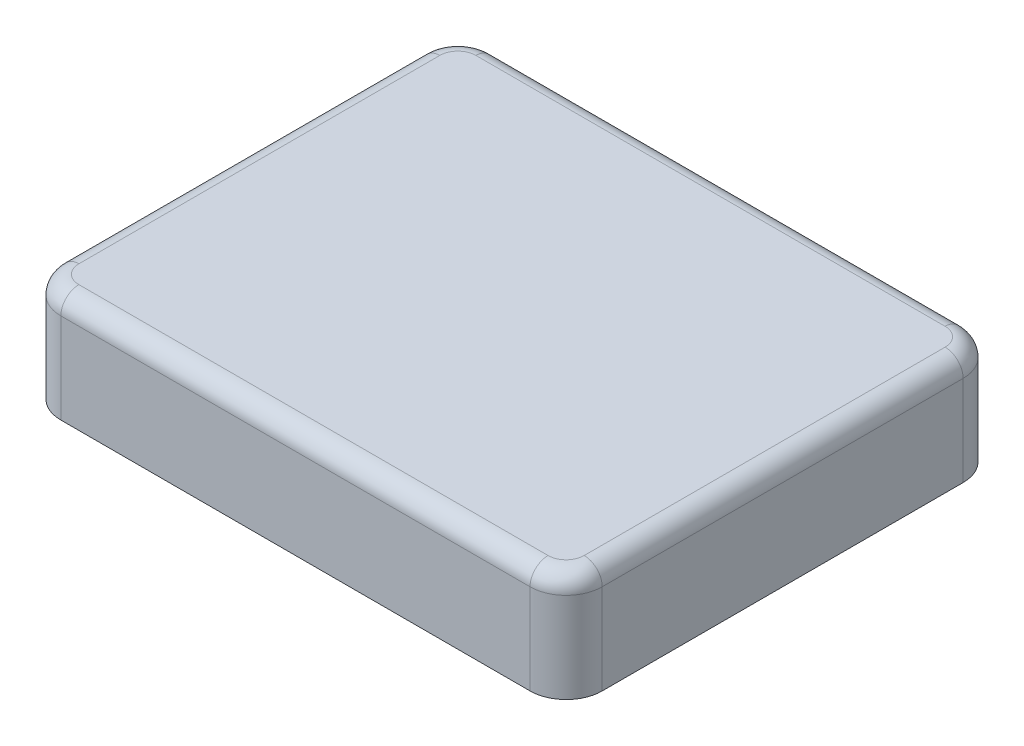
ISO-10303-21;
HEADER;
FILE_DESCRIPTION(('STEP AP214'),'2;1');
FILE_NAME('part.step','',(''),(''),'','','');
FILE_SCHEMA(('AUTOMOTIVE_DESIGN { 1 0 10303 214 1 1 1 1 }'));
ENDSEC;
DATA;
#1=APPLICATION_CONTEXT('core data for automotive mechanical design processes');
#2=APPLICATION_PROTOCOL_DEFINITION('international standard','automotive_design',2000,#1);
#3=PRODUCT_CONTEXT('',#1,'mechanical');
#4=PRODUCT('Part','Part','',(#3));
#5=PRODUCT_RELATED_PRODUCT_CATEGORY('part','',(#4));
#6=PRODUCT_DEFINITION_FORMATION('','',#4);
#7=PRODUCT_DEFINITION_CONTEXT('part definition',#1,'design');
#8=PRODUCT_DEFINITION('design','',#6,#7);
#9=PRODUCT_DEFINITION_SHAPE('','',#8);
#10=(LENGTH_UNIT() NAMED_UNIT(*) SI_UNIT(.MILLI.,.METRE.));
#11=(NAMED_UNIT(*) PLANE_ANGLE_UNIT() SI_UNIT($,.RADIAN.));
#12=(NAMED_UNIT(*) SI_UNIT($,.STERADIAN.) SOLID_ANGLE_UNIT());
#13=UNCERTAINTY_MEASURE_WITH_UNIT(LENGTH_MEASURE(1.E-05),#10,'distance_accuracy_value','');
#14=(GEOMETRIC_REPRESENTATION_CONTEXT(3) GLOBAL_UNCERTAINTY_ASSIGNED_CONTEXT((#13)) GLOBAL_UNIT_ASSIGNED_CONTEXT((#10,
#11,#12)) REPRESENTATION_CONTEXT('',''));
#15=CARTESIAN_POINT('',(0.,0.,0.));
#16=DIRECTION('',(0.,0.,1.));
#17=DIRECTION('',(1.,0.,0.));
#18=AXIS2_PLACEMENT_3D('',#15,#16,#17);
#19=CARTESIAN_POINT('',(0.,0.,0.));
#20=DIRECTION('',(0.,1.,0.));
#21=DIRECTION('',(0.,0.,1.));
#22=AXIS2_PLACEMENT_3D('',#19,#20,#21);
#23=PLANE('',#22);
#24=DIRECTION('',(0.,0.,1.));
#25=VECTOR('',#24,1.);
#26=CARTESIAN_POINT('',(-75.,0.,-60.));
#27=LINE('',#26,#25);
#28=CARTESIAN_POINT('',(-75.,0.,-50.));
#29=VERTEX_POINT('',#28);
#30=CARTESIAN_POINT('',(-75.,0.,50.));
#31=VERTEX_POINT('',#30);
#32=EDGE_CURVE('E242',#29,#31,#27,.T.);
#33=ORIENTED_EDGE('',*,*,#32,.F.);
#34=CARTESIAN_POINT('',(-65.,0.,-50.));
#35=DIRECTION('',(0.,1.,0.));
#36=DIRECTION('',(0.,0.,1.));
#37=AXIS2_PLACEMENT_3D('',#34,#35,#36);
#38=CIRCLE('',#37,10.);
#39=CARTESIAN_POINT('',(-65.,0.,-60.));
#40=VERTEX_POINT('',#39);
#41=EDGE_CURVE('E285',#29,#40,#38,.F.);
#42=ORIENTED_EDGE('',*,*,#41,.T.);
#43=DIRECTION('',(-1.,0.,0.));
#44=VECTOR('',#43,1.);
#45=CARTESIAN_POINT('',(-75.,0.,-60.));
#46=LINE('',#45,#44);
#47=CARTESIAN_POINT('',(65.,0.,-60.));
#48=VERTEX_POINT('',#47);
#49=EDGE_CURVE('E271',#48,#40,#46,.T.);
#50=ORIENTED_EDGE('',*,*,#49,.F.);
#51=CARTESIAN_POINT('',(65.,0.,-50.));
#52=DIRECTION('',(0.,1.,0.));
#53=DIRECTION('',(0.,0.,1.));
#54=AXIS2_PLACEMENT_3D('',#51,#52,#53);
#55=CIRCLE('',#54,10.);
#56=CARTESIAN_POINT('',(75.,0.,-50.));
#57=VERTEX_POINT('',#56);
#58=EDGE_CURVE('E281',#48,#57,#55,.F.);
#59=ORIENTED_EDGE('',*,*,#58,.T.);
#60=DIRECTION('',(0.,0.,-1.));
#61=VECTOR('',#60,1.);
#62=CARTESIAN_POINT('',(75.,0.,-60.));
#63=LINE('',#62,#61);
#64=CARTESIAN_POINT('',(75.,0.,50.));
#65=VERTEX_POINT('',#64);
#66=EDGE_CURVE('E268',#65,#57,#63,.T.);
#67=ORIENTED_EDGE('',*,*,#66,.F.);
#68=CARTESIAN_POINT('',(65.,0.,50.));
#69=DIRECTION('',(0.,1.,0.));
#70=DIRECTION('',(0.,0.,1.));
#71=AXIS2_PLACEMENT_3D('',#68,#69,#70);
#72=CIRCLE('',#71,10.);
#73=CARTESIAN_POINT('',(65.,0.,60.));
#74=VERTEX_POINT('',#73);
#75=EDGE_CURVE('E279',#65,#74,#72,.F.);
#76=ORIENTED_EDGE('',*,*,#75,.T.);
#77=DIRECTION('',(1.,0.,0.));
#78=VECTOR('',#77,1.);
#79=CARTESIAN_POINT('',(-75.,0.,60.));
#80=LINE('',#79,#78);
#81=CARTESIAN_POINT('',(-65.,0.,60.));
#82=VERTEX_POINT('',#81);
#83=EDGE_CURVE('E265',#82,#74,#80,.T.);
#84=ORIENTED_EDGE('',*,*,#83,.F.);
#85=CARTESIAN_POINT('',(-65.,0.,50.));
#86=DIRECTION('',(0.,1.,0.));
#87=DIRECTION('',(0.,0.,1.));
#88=AXIS2_PLACEMENT_3D('',#85,#86,#87);
#89=CIRCLE('',#88,10.);
#90=EDGE_CURVE('E283',#82,#31,#89,.F.);
#91=ORIENTED_EDGE('',*,*,#90,.T.);
#92=EDGE_LOOP('',(#33,#42,#50,#59,#67,#76,#84,#91));
#93=FACE_BOUND('',#92,.T.);
#94=CARTESIAN_POINT('',(-65.,0.,-50.));
#95=DIRECTION('',(0.,1.,0.));
#96=DIRECTION('',(0.,0.,1.));
#97=AXIS2_PLACEMENT_3D('',#94,#95,#96);
#98=CIRCLE('',#97,6.5);
#99=CARTESIAN_POINT('',(-71.5,0.,-50.));
#100=VERTEX_POINT('',#99);
#101=CARTESIAN_POINT('',(-65.,0.,-56.5));
#102=VERTEX_POINT('',#101);
#103=EDGE_CURVE('E245',#100,#102,#98,.F.);
#104=ORIENTED_EDGE('',*,*,#103,.F.);
#105=DIRECTION('',(0.,0.,1.));
#106=VECTOR('',#105,1.);
#107=CARTESIAN_POINT('',(-71.5,0.,-60.));
#108=LINE('',#107,#106);
#109=CARTESIAN_POINT('',(-71.5,0.,50.));
#110=VERTEX_POINT('',#109);
#111=EDGE_CURVE('E247',#100,#110,#108,.T.);
#112=ORIENTED_EDGE('',*,*,#111,.T.);
#113=CARTESIAN_POINT('',(-65.,0.,50.));
#114=DIRECTION('',(0.,1.,0.));
#115=DIRECTION('',(0.,0.,1.));
#116=AXIS2_PLACEMENT_3D('',#113,#114,#115);
#117=CIRCLE('',#116,6.5);
#118=CARTESIAN_POINT('',(-65.,0.,56.5));
#119=VERTEX_POINT('',#118);
#120=EDGE_CURVE('E199',#119,#110,#117,.F.);
#121=ORIENTED_EDGE('',*,*,#120,.F.);
#122=DIRECTION('',(1.,0.,0.));
#123=VECTOR('',#122,1.);
#124=CARTESIAN_POINT('',(-75.,0.,56.5));
#125=LINE('',#124,#123);
#126=CARTESIAN_POINT('',(65.,0.,56.5));
#127=VERTEX_POINT('',#126);
#128=EDGE_CURVE('E249',#119,#127,#125,.T.);
#129=ORIENTED_EDGE('',*,*,#128,.T.);
#130=CARTESIAN_POINT('',(65.,0.,50.));
#131=DIRECTION('',(0.,1.,0.));
#132=DIRECTION('',(0.,0.,1.));
#133=AXIS2_PLACEMENT_3D('',#130,#131,#132);
#134=CIRCLE('',#133,6.5);
#135=CARTESIAN_POINT('',(71.5,0.,50.));
#136=VERTEX_POINT('',#135);
#137=EDGE_CURVE('E256',#136,#127,#134,.F.);
#138=ORIENTED_EDGE('',*,*,#137,.F.);
#139=DIRECTION('',(0.,0.,-1.));
#140=VECTOR('',#139,1.);
#141=CARTESIAN_POINT('',(71.5,0.,-60.));
#142=LINE('',#141,#140);
#143=CARTESIAN_POINT('',(71.5,0.,-50.));
#144=VERTEX_POINT('',#143);
#145=EDGE_CURVE('E253',#136,#144,#142,.T.);
#146=ORIENTED_EDGE('',*,*,#145,.T.);
#147=CARTESIAN_POINT('',(65.,0.,-50.));
#148=DIRECTION('',(0.,1.,0.));
#149=DIRECTION('',(0.,0.,1.));
#150=AXIS2_PLACEMENT_3D('',#147,#148,#149);
#151=CIRCLE('',#150,6.5);
#152=CARTESIAN_POINT('',(65.,0.,-56.5));
#153=VERTEX_POINT('',#152);
#154=EDGE_CURVE('E254',#153,#144,#151,.F.);
#155=ORIENTED_EDGE('',*,*,#154,.F.);
#156=DIRECTION('',(-1.,0.,0.));
#157=VECTOR('',#156,1.);
#158=CARTESIAN_POINT('',(-75.,0.,-56.5));
#159=LINE('',#158,#157);
#160=EDGE_CURVE('E213',#153,#102,#159,.T.);
#161=ORIENTED_EDGE('',*,*,#160,.T.);
#162=EDGE_LOOP('',(#104,#112,#121,#129,#138,#146,#155,#161));
#163=FACE_BOUND('',#162,.T.);
#164=ADVANCED_FACE('F53',(#93,#163),#23,.F.);
#165=CARTESIAN_POINT('',(-75.,30.,-60.));
#166=DIRECTION('',(1.,0.,0.));
#167=DIRECTION('',(0.,0.,-1.));
#168=AXIS2_PLACEMENT_3D('',#165,#166,#167);
#169=PLANE('',#168);
#170=DIRECTION('',(0.,-1.,0.));
#171=VECTOR('',#170,1.);
#172=CARTESIAN_POINT('',(-75.,30.,50.));
#173=LINE('',#172,#171);
#174=CARTESIAN_POINT('',(-75.,25.,50.));
#175=VERTEX_POINT('',#174);
#176=EDGE_CURVE('E274',#31,#175,#173,.F.);
#177=ORIENTED_EDGE('',*,*,#176,.T.);
#178=DIRECTION('',(0.,0.,1.));
#179=VECTOR('',#178,1.);
#180=CARTESIAN_POINT('',(-75.,25.,-50.));
#181=LINE('',#180,#179);
#182=CARTESIAN_POINT('',(-75.,25.,-50.));
#183=VERTEX_POINT('',#182);
#184=EDGE_CURVE('E320',#175,#183,#181,.F.);
#185=ORIENTED_EDGE('',*,*,#184,.T.);
#186=DIRECTION('',(0.,-1.,0.));
#187=VECTOR('',#186,1.);
#188=CARTESIAN_POINT('',(-75.,30.,-50.));
#189=LINE('',#188,#187);
#190=EDGE_CURVE('E277',#183,#29,#189,.T.);
#191=ORIENTED_EDGE('',*,*,#190,.T.);
#192=ORIENTED_EDGE('',*,*,#32,.T.);
#193=EDGE_LOOP('',(#177,#185,#191,#192));
#194=FACE_BOUND('',#193,.T.);
#195=ADVANCED_FACE('F422',(#194),#169,.F.);
#196=CARTESIAN_POINT('',(-75.,30.,60.));
#197=DIRECTION('',(0.,0.,-1.));
#198=DIRECTION('',(-1.,0.,0.));
#199=AXIS2_PLACEMENT_3D('',#196,#197,#198);
#200=PLANE('',#199);
#201=DIRECTION('',(0.,-1.,0.));
#202=VECTOR('',#201,1.);
#203=CARTESIAN_POINT('',(65.,30.,60.));
#204=LINE('',#203,#202);
#205=CARTESIAN_POINT('',(65.,25.,60.));
#206=VERTEX_POINT('',#205);
#207=EDGE_CURVE('E292',#74,#206,#204,.F.);
#208=ORIENTED_EDGE('',*,*,#207,.T.);
#209=DIRECTION('',(1.,0.,0.));
#210=VECTOR('',#209,1.);
#211=CARTESIAN_POINT('',(-65.,25.,60.));
#212=LINE('',#211,#210);
#213=CARTESIAN_POINT('',(-65.,25.,60.));
#214=VERTEX_POINT('',#213);
#215=EDGE_CURVE('E12',#206,#214,#212,.F.);
#216=ORIENTED_EDGE('',*,*,#215,.T.);
#217=DIRECTION('',(0.,-1.,0.));
#218=VECTOR('',#217,1.);
#219=CARTESIAN_POINT('',(-65.,30.,60.));
#220=LINE('',#219,#218);
#221=EDGE_CURVE('E294',#214,#82,#220,.T.);
#222=ORIENTED_EDGE('',*,*,#221,.T.);
#223=ORIENTED_EDGE('',*,*,#83,.T.);
#224=EDGE_LOOP('',(#208,#216,#222,#223));
#225=FACE_BOUND('',#224,.T.);
#226=ADVANCED_FACE('F406',(#225),#200,.F.);
#227=CARTESIAN_POINT('',(75.,30.,-60.));
#228=DIRECTION('',(-1.,0.,0.));
#229=DIRECTION('',(0.,0.,1.));
#230=AXIS2_PLACEMENT_3D('',#227,#228,#229);
#231=PLANE('',#230);
#232=DIRECTION('',(0.,-1.,0.));
#233=VECTOR('',#232,1.);
#234=CARTESIAN_POINT('',(75.,30.,-50.));
#235=LINE('',#234,#233);
#236=CARTESIAN_POINT('',(75.,25.,-50.));
#237=VERTEX_POINT('',#236);
#238=EDGE_CURVE('E298',#57,#237,#235,.F.);
#239=ORIENTED_EDGE('',*,*,#238,.T.);
#240=DIRECTION('',(0.,0.,-1.));
#241=VECTOR('',#240,1.);
#242=CARTESIAN_POINT('',(75.,25.,50.));
#243=LINE('',#242,#241);
#244=CARTESIAN_POINT('',(75.,25.,50.));
#245=VERTEX_POINT('',#244);
#246=EDGE_CURVE('E77',#237,#245,#243,.F.);
#247=ORIENTED_EDGE('',*,*,#246,.T.);
#248=DIRECTION('',(0.,-1.,0.));
#249=VECTOR('',#248,1.);
#250=CARTESIAN_POINT('',(75.,30.,50.));
#251=LINE('',#250,#249);
#252=EDGE_CURVE('E296',#245,#65,#251,.T.);
#253=ORIENTED_EDGE('',*,*,#252,.T.);
#254=ORIENTED_EDGE('',*,*,#66,.T.);
#255=EDGE_LOOP('',(#239,#247,#253,#254));
#256=FACE_BOUND('',#255,.T.);
#257=ADVANCED_FACE('F365',(#256),#231,.F.);
#258=CARTESIAN_POINT('',(-75.,30.,-60.));
#259=DIRECTION('',(0.,0.,1.));
#260=DIRECTION('',(1.,0.,0.));
#261=AXIS2_PLACEMENT_3D('',#258,#259,#260);
#262=PLANE('',#261);
#263=DIRECTION('',(0.,-1.,0.));
#264=VECTOR('',#263,1.);
#265=CARTESIAN_POINT('',(-65.,30.,-60.));
#266=LINE('',#265,#264);
#267=CARTESIAN_POINT('',(-65.,25.,-60.));
#268=VERTEX_POINT('',#267);
#269=EDGE_CURVE('E289',#40,#268,#266,.F.);
#270=ORIENTED_EDGE('',*,*,#269,.T.);
#271=DIRECTION('',(-1.,0.,0.));
#272=VECTOR('',#271,1.);
#273=CARTESIAN_POINT('',(65.,25.,-60.));
#274=LINE('',#273,#272);
#275=CARTESIAN_POINT('',(65.,25.,-60.));
#276=VERTEX_POINT('',#275);
#277=EDGE_CURVE('E324',#268,#276,#274,.F.);
#278=ORIENTED_EDGE('',*,*,#277,.T.);
#279=DIRECTION('',(0.,-1.,0.));
#280=VECTOR('',#279,1.);
#281=CARTESIAN_POINT('',(65.,30.,-60.));
#282=LINE('',#281,#280);
#283=EDGE_CURVE('E287',#276,#48,#282,.T.);
#284=ORIENTED_EDGE('',*,*,#283,.T.);
#285=ORIENTED_EDGE('',*,*,#49,.T.);
#286=EDGE_LOOP('',(#270,#278,#284,#285));
#287=FACE_BOUND('',#286,.T.);
#288=ADVANCED_FACE('F376',(#287),#262,.F.);
#289=CARTESIAN_POINT('',(0.,30.,0.));
#290=DIRECTION('',(0.,1.,0.));
#291=DIRECTION('',(0.,0.,1.));
#292=AXIS2_PLACEMENT_3D('',#289,#290,#291);
#293=PLANE('',#292);
#294=DIRECTION('',(0.,0.,1.));
#295=VECTOR('',#294,1.);
#296=CARTESIAN_POINT('',(-70.,30.,50.));
#297=LINE('',#296,#295);
#298=CARTESIAN_POINT('',(-70.,30.,-50.));
#299=VERTEX_POINT('',#298);
#300=CARTESIAN_POINT('',(-70.,30.,50.));
#301=VERTEX_POINT('',#300);
#302=EDGE_CURVE('E312',#299,#301,#297,.T.);
#303=ORIENTED_EDGE('',*,*,#302,.T.);
#304=CARTESIAN_POINT('',(-65.,30.,50.));
#305=DIRECTION('',(0.,1.,0.));
#306=DIRECTION('',(0.,0.,1.));
#307=AXIS2_PLACEMENT_3D('',#304,#305,#306);
#308=CIRCLE('',#307,5.);
#309=CARTESIAN_POINT('',(-65.,30.,55.));
#310=VERTEX_POINT('',#309);
#311=EDGE_CURVE('E314',#301,#310,#308,.T.);
#312=ORIENTED_EDGE('',*,*,#311,.T.);
#313=DIRECTION('',(1.,0.,0.));
#314=VECTOR('',#313,1.);
#315=CARTESIAN_POINT('',(65.,30.,55.));
#316=LINE('',#315,#314);
#317=CARTESIAN_POINT('',(65.,30.,55.));
#318=VERTEX_POINT('',#317);
#319=EDGE_CURVE('E300',#310,#318,#316,.T.);
#320=ORIENTED_EDGE('',*,*,#319,.T.);
#321=CARTESIAN_POINT('',(65.,30.,50.));
#322=DIRECTION('',(0.,1.,0.));
#323=DIRECTION('',(0.,0.,1.));
#324=AXIS2_PLACEMENT_3D('',#321,#322,#323);
#325=CIRCLE('',#324,5.);
#326=CARTESIAN_POINT('',(70.,30.,50.));
#327=VERTEX_POINT('',#326);
#328=EDGE_CURVE('E302',#318,#327,#325,.T.);
#329=ORIENTED_EDGE('',*,*,#328,.T.);
#330=DIRECTION('',(0.,0.,-1.));
#331=VECTOR('',#330,1.);
#332=CARTESIAN_POINT('',(70.,30.,-50.));
#333=LINE('',#332,#331);
#334=CARTESIAN_POINT('',(70.,30.,-50.));
#335=VERTEX_POINT('',#334);
#336=EDGE_CURVE('E304',#327,#335,#333,.T.);
#337=ORIENTED_EDGE('',*,*,#336,.T.);
#338=CARTESIAN_POINT('',(65.,30.,-50.));
#339=DIRECTION('',(0.,1.,0.));
#340=DIRECTION('',(0.,0.,1.));
#341=AXIS2_PLACEMENT_3D('',#338,#339,#340);
#342=CIRCLE('',#341,5.);
#343=CARTESIAN_POINT('',(65.,30.,-55.));
#344=VERTEX_POINT('',#343);
#345=EDGE_CURVE('E306',#335,#344,#342,.T.);
#346=ORIENTED_EDGE('',*,*,#345,.T.);
#347=DIRECTION('',(-1.,0.,0.));
#348=VECTOR('',#347,1.);
#349=CARTESIAN_POINT('',(-65.,30.,-55.));
#350=LINE('',#349,#348);
#351=CARTESIAN_POINT('',(-65.,30.,-55.));
#352=VERTEX_POINT('',#351);
#353=EDGE_CURVE('E308',#344,#352,#350,.T.);
#354=ORIENTED_EDGE('',*,*,#353,.T.);
#355=CARTESIAN_POINT('',(-65.,30.,-50.));
#356=DIRECTION('',(0.,1.,0.));
#357=DIRECTION('',(0.,0.,1.));
#358=AXIS2_PLACEMENT_3D('',#355,#356,#357);
#359=CIRCLE('',#358,5.);
#360=EDGE_CURVE('E310',#352,#299,#359,.T.);
#361=ORIENTED_EDGE('',*,*,#360,.T.);
#362=EDGE_LOOP('',(#303,#312,#320,#329,#337,#346,#354,#361));
#363=FACE_BOUND('',#362,.T.);
#364=ADVANCED_FACE('F392',(#363),#293,.T.);
#365=CARTESIAN_POINT('',(-65.,30.,-50.));
#366=DIRECTION('',(0.,-1.,0.));
#367=DIRECTION('',(0.,0.,-1.));
#368=AXIS2_PLACEMENT_3D('',#365,#366,#367);
#369=CYLINDRICAL_SURFACE('',#368,10.);
#370=ORIENTED_EDGE('',*,*,#190,.F.);
#371=CARTESIAN_POINT('',(-65.,25.,-50.));
#372=DIRECTION('',(0.,1.,0.));
#373=DIRECTION('',(0.,0.,1.));
#374=AXIS2_PLACEMENT_3D('',#371,#372,#373);
#375=CIRCLE('',#374,10.);
#376=EDGE_CURVE('E322',#183,#268,#375,.F.);
#377=ORIENTED_EDGE('',*,*,#376,.T.);
#378=ORIENTED_EDGE('',*,*,#269,.F.);
#379=ORIENTED_EDGE('',*,*,#41,.F.);
#380=EDGE_LOOP('',(#370,#377,#378,#379));
#381=FACE_BOUND('',#380,.T.);
#382=ADVANCED_FACE('F379',(#381),#369,.T.);
#383=CARTESIAN_POINT('',(-65.,30.,50.));
#384=DIRECTION('',(0.,-1.,0.));
#385=DIRECTION('',(0.,0.,-1.));
#386=AXIS2_PLACEMENT_3D('',#383,#384,#385);
#387=CYLINDRICAL_SURFACE('',#386,10.);
#388=ORIENTED_EDGE('',*,*,#221,.F.);
#389=CARTESIAN_POINT('',(-65.,25.,50.));
#390=DIRECTION('',(0.,1.,0.));
#391=DIRECTION('',(0.,0.,1.));
#392=AXIS2_PLACEMENT_3D('',#389,#390,#391);
#393=CIRCLE('',#392,10.);
#394=EDGE_CURVE('E317',#214,#175,#393,.F.);
#395=ORIENTED_EDGE('',*,*,#394,.T.);
#396=ORIENTED_EDGE('',*,*,#176,.F.);
#397=ORIENTED_EDGE('',*,*,#90,.F.);
#398=EDGE_LOOP('',(#388,#395,#396,#397));
#399=FACE_BOUND('',#398,.T.);
#400=ADVANCED_FACE('F410',(#399),#387,.T.);
#401=CARTESIAN_POINT('',(65.,30.,-50.));
#402=DIRECTION('',(0.,-1.,0.));
#403=DIRECTION('',(0.,0.,-1.));
#404=AXIS2_PLACEMENT_3D('',#401,#402,#403);
#405=CYLINDRICAL_SURFACE('',#404,10.);
#406=ORIENTED_EDGE('',*,*,#283,.F.);
#407=CARTESIAN_POINT('',(65.,25.,-50.));
#408=DIRECTION('',(0.,1.,0.));
#409=DIRECTION('',(0.,0.,1.));
#410=AXIS2_PLACEMENT_3D('',#407,#408,#409);
#411=CIRCLE('',#410,10.);
#412=EDGE_CURVE('E326',#276,#237,#411,.F.);
#413=ORIENTED_EDGE('',*,*,#412,.T.);
#414=ORIENTED_EDGE('',*,*,#238,.F.);
#415=ORIENTED_EDGE('',*,*,#58,.F.);
#416=EDGE_LOOP('',(#406,#413,#414,#415));
#417=FACE_BOUND('',#416,.T.);
#418=ADVANCED_FACE('F363',(#417),#405,.T.);
#419=CARTESIAN_POINT('',(65.,30.,50.));
#420=DIRECTION('',(0.,-1.,0.));
#421=DIRECTION('',(0.,0.,-1.));
#422=AXIS2_PLACEMENT_3D('',#419,#420,#421);
#423=CYLINDRICAL_SURFACE('',#422,10.);
#424=ORIENTED_EDGE('',*,*,#252,.F.);
#425=CARTESIAN_POINT('',(65.,25.,50.));
#426=DIRECTION('',(0.,1.,0.));
#427=DIRECTION('',(0.,0.,1.));
#428=AXIS2_PLACEMENT_3D('',#425,#426,#427);
#429=CIRCLE('',#428,10.);
#430=EDGE_CURVE('E62',#245,#206,#429,.F.);
#431=ORIENTED_EDGE('',*,*,#430,.T.);
#432=ORIENTED_EDGE('',*,*,#207,.F.);
#433=ORIENTED_EDGE('',*,*,#75,.F.);
#434=EDGE_LOOP('',(#424,#431,#432,#433));
#435=FACE_BOUND('',#434,.T.);
#436=ADVANCED_FACE('F443',(#435),#423,.T.);
#437=CARTESIAN_POINT('',(-71.5,30.,-60.));
#438=DIRECTION('',(1.,0.,0.));
#439=DIRECTION('',(0.,0.,-1.));
#440=AXIS2_PLACEMENT_3D('',#437,#438,#439);
#441=PLANE('',#440);
#442=DIRECTION('',(0.,0.,1.));
#443=VECTOR('',#442,1.);
#444=CARTESIAN_POINT('',(-71.5,26.5,-60.));
#445=LINE('',#444,#443);
#446=CARTESIAN_POINT('',(-71.5,26.5,-50.));
#447=VERTEX_POINT('',#446);
#448=CARTESIAN_POINT('',(-71.5,26.5,50.));
#449=VERTEX_POINT('',#448);
#450=EDGE_CURVE('E208',#447,#449,#445,.T.);
#451=ORIENTED_EDGE('',*,*,#450,.T.);
#452=DIRECTION('',(0.,1.,0.));
#453=VECTOR('',#452,1.);
#454=CARTESIAN_POINT('',(-71.5,30.,50.));
#455=LINE('',#454,#453);
#456=EDGE_CURVE('E191',#110,#449,#455,.T.);
#457=ORIENTED_EDGE('',*,*,#456,.F.);
#458=ORIENTED_EDGE('',*,*,#111,.F.);
#459=DIRECTION('',(0.,1.,0.));
#460=VECTOR('',#459,1.);
#461=CARTESIAN_POINT('',(-71.5,30.,-50.));
#462=LINE('',#461,#460);
#463=EDGE_CURVE('E203',#447,#100,#462,.F.);
#464=ORIENTED_EDGE('',*,*,#463,.F.);
#465=EDGE_LOOP('',(#451,#457,#458,#464));
#466=FACE_BOUND('',#465,.T.);
#467=ADVANCED_FACE('F209',(#466),#441,.T.);
#468=CARTESIAN_POINT('',(-75.,30.,56.5));
#469=DIRECTION('',(0.,0.,-1.));
#470=DIRECTION('',(-1.,0.,0.));
#471=AXIS2_PLACEMENT_3D('',#468,#469,#470);
#472=PLANE('',#471);
#473=DIRECTION('',(1.,0.,0.));
#474=VECTOR('',#473,1.);
#475=CARTESIAN_POINT('',(-75.,26.5,56.5));
#476=LINE('',#475,#474);
#477=CARTESIAN_POINT('',(-65.,26.5,56.5));
#478=VERTEX_POINT('',#477);
#479=CARTESIAN_POINT('',(65.,26.5,56.5));
#480=VERTEX_POINT('',#479);
#481=EDGE_CURVE('E212',#478,#480,#476,.T.);
#482=ORIENTED_EDGE('',*,*,#481,.T.);
#483=DIRECTION('',(0.,1.,0.));
#484=VECTOR('',#483,1.);
#485=CARTESIAN_POINT('',(65.,30.,56.5));
#486=LINE('',#485,#484);
#487=EDGE_CURVE('E223',#127,#480,#486,.T.);
#488=ORIENTED_EDGE('',*,*,#487,.F.);
#489=ORIENTED_EDGE('',*,*,#128,.F.);
#490=DIRECTION('',(0.,1.,0.));
#491=VECTOR('',#490,1.);
#492=CARTESIAN_POINT('',(-65.,30.,56.5));
#493=LINE('',#492,#491);
#494=EDGE_CURVE('E235',#478,#119,#493,.F.);
#495=ORIENTED_EDGE('',*,*,#494,.F.);
#496=EDGE_LOOP('',(#482,#488,#489,#495));
#497=FACE_BOUND('',#496,.T.);
#498=ADVANCED_FACE('F448',(#497),#472,.T.);
#499=CARTESIAN_POINT('',(71.5,30.,-60.));
#500=DIRECTION('',(-1.,0.,0.));
#501=DIRECTION('',(0.,0.,1.));
#502=AXIS2_PLACEMENT_3D('',#499,#500,#501);
#503=PLANE('',#502);
#504=ORIENTED_EDGE('',*,*,#145,.F.);
#505=DIRECTION('',(0.,1.,0.));
#506=VECTOR('',#505,1.);
#507=CARTESIAN_POINT('',(71.5,30.,50.));
#508=LINE('',#507,#506);
#509=CARTESIAN_POINT('',(71.5,26.5,50.));
#510=VERTEX_POINT('',#509);
#511=EDGE_CURVE('E237',#510,#136,#508,.F.);
#512=ORIENTED_EDGE('',*,*,#511,.F.);
#513=DIRECTION('',(0.,0.,-1.));
#514=VECTOR('',#513,1.);
#515=CARTESIAN_POINT('',(71.5,26.5,-60.));
#516=LINE('',#515,#514);
#517=CARTESIAN_POINT('',(71.5,26.5,-50.));
#518=VERTEX_POINT('',#517);
#519=EDGE_CURVE('E230',#510,#518,#516,.T.);
#520=ORIENTED_EDGE('',*,*,#519,.T.);
#521=DIRECTION('',(0.,1.,0.));
#522=VECTOR('',#521,1.);
#523=CARTESIAN_POINT('',(71.5,30.,-50.));
#524=LINE('',#523,#522);
#525=EDGE_CURVE('E240',#144,#518,#524,.T.);
#526=ORIENTED_EDGE('',*,*,#525,.F.);
#527=EDGE_LOOP('',(#504,#512,#520,#526));
#528=FACE_BOUND('',#527,.T.);
#529=ADVANCED_FACE('F453',(#528),#503,.T.);
#530=CARTESIAN_POINT('',(-75.,30.,-56.5));
#531=DIRECTION('',(0.,0.,1.));
#532=DIRECTION('',(1.,0.,0.));
#533=AXIS2_PLACEMENT_3D('',#530,#531,#532);
#534=PLANE('',#533);
#535=ORIENTED_EDGE('',*,*,#160,.F.);
#536=DIRECTION('',(0.,1.,0.));
#537=VECTOR('',#536,1.);
#538=CARTESIAN_POINT('',(65.,30.,-56.5));
#539=LINE('',#538,#537);
#540=CARTESIAN_POINT('',(65.,26.5,-56.5));
#541=VERTEX_POINT('',#540);
#542=EDGE_CURVE('E243',#541,#153,#539,.F.);
#543=ORIENTED_EDGE('',*,*,#542,.F.);
#544=DIRECTION('',(-1.,0.,0.));
#545=VECTOR('',#544,1.);
#546=CARTESIAN_POINT('',(-75.,26.5,-56.5));
#547=LINE('',#546,#545);
#548=CARTESIAN_POINT('',(-65.,26.5,-56.5));
#549=VERTEX_POINT('',#548);
#550=EDGE_CURVE('E204',#541,#549,#547,.T.);
#551=ORIENTED_EDGE('',*,*,#550,.T.);
#552=DIRECTION('',(0.,1.,0.));
#553=VECTOR('',#552,1.);
#554=CARTESIAN_POINT('',(-65.,30.,-56.5));
#555=LINE('',#554,#553);
#556=EDGE_CURVE('E232',#102,#549,#555,.T.);
#557=ORIENTED_EDGE('',*,*,#556,.F.);
#558=EDGE_LOOP('',(#535,#543,#551,#557));
#559=FACE_BOUND('',#558,.T.);
#560=ADVANCED_FACE('F459',(#559),#534,.T.);
#561=CARTESIAN_POINT('',(0.,26.5,0.));
#562=DIRECTION('',(0.,1.,0.));
#563=DIRECTION('',(0.,0.,1.));
#564=AXIS2_PLACEMENT_3D('',#561,#562,#563);
#565=PLANE('',#564);
#566=ORIENTED_EDGE('',*,*,#550,.F.);
#567=CARTESIAN_POINT('',(65.,26.5,-50.));
#568=DIRECTION('',(0.,1.,0.));
#569=DIRECTION('',(0.,0.,1.));
#570=AXIS2_PLACEMENT_3D('',#567,#568,#569);
#571=CIRCLE('',#570,6.5);
#572=EDGE_CURVE('E221',#518,#541,#571,.T.);
#573=ORIENTED_EDGE('',*,*,#572,.F.);
#574=ORIENTED_EDGE('',*,*,#519,.F.);
#575=CARTESIAN_POINT('',(65.,26.5,50.));
#576=DIRECTION('',(0.,1.,0.));
#577=DIRECTION('',(0.,0.,1.));
#578=AXIS2_PLACEMENT_3D('',#575,#576,#577);
#579=CIRCLE('',#578,6.5);
#580=EDGE_CURVE('E225',#480,#510,#579,.T.);
#581=ORIENTED_EDGE('',*,*,#580,.F.);
#582=ORIENTED_EDGE('',*,*,#481,.F.);
#583=CARTESIAN_POINT('',(-65.,26.5,50.));
#584=DIRECTION('',(0.,1.,0.));
#585=DIRECTION('',(0.,0.,1.));
#586=AXIS2_PLACEMENT_3D('',#583,#584,#585);
#587=CIRCLE('',#586,6.5);
#588=EDGE_CURVE('E196',#449,#478,#587,.T.);
#589=ORIENTED_EDGE('',*,*,#588,.F.);
#590=ORIENTED_EDGE('',*,*,#450,.F.);
#591=CARTESIAN_POINT('',(-65.,26.5,-50.));
#592=DIRECTION('',(0.,1.,0.));
#593=DIRECTION('',(0.,0.,1.));
#594=AXIS2_PLACEMENT_3D('',#591,#592,#593);
#595=CIRCLE('',#594,6.5);
#596=EDGE_CURVE('E220',#549,#447,#595,.T.);
#597=ORIENTED_EDGE('',*,*,#596,.F.);
#598=EDGE_LOOP('',(#566,#573,#574,#581,#582,#589,#590,#597));
#599=FACE_BOUND('',#598,.T.);
#600=ADVANCED_FACE('F216',(#599),#565,.F.);
#601=CARTESIAN_POINT('',(-65.,30.,-50.));
#602=DIRECTION('',(0.,-1.,0.));
#603=DIRECTION('',(0.,0.,-1.));
#604=AXIS2_PLACEMENT_3D('',#601,#602,#603);
#605=CYLINDRICAL_SURFACE('',#604,6.5);
#606=ORIENTED_EDGE('',*,*,#596,.T.);
#607=ORIENTED_EDGE('',*,*,#463,.T.);
#608=ORIENTED_EDGE('',*,*,#103,.T.);
#609=ORIENTED_EDGE('',*,*,#556,.T.);
#610=EDGE_LOOP('',(#606,#607,#608,#609));
#611=FACE_BOUND('',#610,.T.);
#612=ADVANCED_FACE('F466',(#611),#605,.F.);
#613=CARTESIAN_POINT('',(-65.,30.,50.));
#614=DIRECTION('',(0.,-1.,0.));
#615=DIRECTION('',(0.,0.,-1.));
#616=AXIS2_PLACEMENT_3D('',#613,#614,#615);
#617=CYLINDRICAL_SURFACE('',#616,6.5);
#618=ORIENTED_EDGE('',*,*,#588,.T.);
#619=ORIENTED_EDGE('',*,*,#494,.T.);
#620=ORIENTED_EDGE('',*,*,#120,.T.);
#621=ORIENTED_EDGE('',*,*,#456,.T.);
#622=EDGE_LOOP('',(#618,#619,#620,#621));
#623=FACE_BOUND('',#622,.T.);
#624=ADVANCED_FACE('F193',(#623),#617,.F.);
#625=CARTESIAN_POINT('',(65.,30.,-50.));
#626=DIRECTION('',(0.,-1.,0.));
#627=DIRECTION('',(0.,0.,-1.));
#628=AXIS2_PLACEMENT_3D('',#625,#626,#627);
#629=CYLINDRICAL_SURFACE('',#628,6.5);
#630=ORIENTED_EDGE('',*,*,#572,.T.);
#631=ORIENTED_EDGE('',*,*,#542,.T.);
#632=ORIENTED_EDGE('',*,*,#154,.T.);
#633=ORIENTED_EDGE('',*,*,#525,.T.);
#634=EDGE_LOOP('',(#630,#631,#632,#633));
#635=FACE_BOUND('',#634,.T.);
#636=ADVANCED_FACE('F472',(#635),#629,.F.);
#637=CARTESIAN_POINT('',(65.,30.,50.));
#638=DIRECTION('',(0.,-1.,0.));
#639=DIRECTION('',(0.,0.,-1.));
#640=AXIS2_PLACEMENT_3D('',#637,#638,#639);
#641=CYLINDRICAL_SURFACE('',#640,6.5);
#642=ORIENTED_EDGE('',*,*,#580,.T.);
#643=ORIENTED_EDGE('',*,*,#511,.T.);
#644=ORIENTED_EDGE('',*,*,#137,.T.);
#645=ORIENTED_EDGE('',*,*,#487,.T.);
#646=EDGE_LOOP('',(#642,#643,#644,#645));
#647=FACE_BOUND('',#646,.T.);
#648=ADVANCED_FACE('F474',(#647),#641,.F.);
#649=CARTESIAN_POINT('',(65.,25.,-50.));
#650=DIRECTION('',(0.,1.,0.));
#651=DIRECTION('',(0.,0.,1.));
#652=AXIS2_PLACEMENT_3D('',#649,#650,#651);
#653=DEGENERATE_TOROIDAL_SURFACE('',#652,5.,5.,.T.);
#654=CARTESIAN_POINT('',(70.,25.,-50.));
#655=DIRECTION('',(0.,0.,1.));
#656=DIRECTION('',(1.,0.,0.));
#657=AXIS2_PLACEMENT_3D('',#654,#655,#656);
#658=CIRCLE('',#657,5.);
#659=EDGE_CURVE('E345',#237,#335,#658,.T.);
#660=ORIENTED_EDGE('',*,*,#659,.F.);
#661=ORIENTED_EDGE('',*,*,#412,.F.);
#662=CARTESIAN_POINT('',(65.,25.,-55.));
#663=DIRECTION('',(-1.,0.,0.));
#664=DIRECTION('',(0.,0.,1.));
#665=AXIS2_PLACEMENT_3D('',#662,#663,#664);
#666=CIRCLE('',#665,5.);
#667=EDGE_CURVE('E57',#344,#276,#666,.T.);
#668=ORIENTED_EDGE('',*,*,#667,.F.);
#669=ORIENTED_EDGE('',*,*,#345,.F.);
#670=EDGE_LOOP('',(#660,#661,#668,#669));
#671=FACE_BOUND('',#670,.T.);
#672=ADVANCED_FACE('F55',(#671),#653,.T.);
#673=CARTESIAN_POINT('',(0.,25.,-55.));
#674=DIRECTION('',(1.,0.,0.));
#675=DIRECTION('',(0.,0.,-1.));
#676=AXIS2_PLACEMENT_3D('',#673,#674,#675);
#677=CYLINDRICAL_SURFACE('',#676,5.);
#678=ORIENTED_EDGE('',*,*,#667,.T.);
#679=ORIENTED_EDGE('',*,*,#277,.F.);
#680=CARTESIAN_POINT('',(-65.,25.,-55.));
#681=DIRECTION('',(-1.,0.,0.));
#682=DIRECTION('',(0.,0.,1.));
#683=AXIS2_PLACEMENT_3D('',#680,#681,#682);
#684=CIRCLE('',#683,5.);
#685=EDGE_CURVE('E343',#352,#268,#684,.T.);
#686=ORIENTED_EDGE('',*,*,#685,.F.);
#687=ORIENTED_EDGE('',*,*,#353,.F.);
#688=EDGE_LOOP('',(#678,#679,#686,#687));
#689=FACE_BOUND('',#688,.T.);
#690=ADVANCED_FACE('F355',(#689),#677,.T.);
#691=CARTESIAN_POINT('',(70.,25.,0.));
#692=DIRECTION('',(0.,0.,1.));
#693=DIRECTION('',(1.,0.,0.));
#694=AXIS2_PLACEMENT_3D('',#691,#692,#693);
#695=CYLINDRICAL_SURFACE('',#694,5.);
#696=ORIENTED_EDGE('',*,*,#659,.T.);
#697=ORIENTED_EDGE('',*,*,#336,.F.);
#698=CARTESIAN_POINT('',(70.,25.,50.));
#699=DIRECTION('',(0.,0.,1.));
#700=DIRECTION('',(1.,0.,0.));
#701=AXIS2_PLACEMENT_3D('',#698,#699,#700);
#702=CIRCLE('',#701,5.);
#703=EDGE_CURVE('E340',#245,#327,#702,.T.);
#704=ORIENTED_EDGE('',*,*,#703,.F.);
#705=ORIENTED_EDGE('',*,*,#246,.F.);
#706=EDGE_LOOP('',(#696,#697,#704,#705));
#707=FACE_BOUND('',#706,.T.);
#708=ADVANCED_FACE('F395',(#707),#695,.T.);
#709=CARTESIAN_POINT('',(-65.,25.,-50.));
#710=DIRECTION('',(0.,1.,0.));
#711=DIRECTION('',(0.,0.,1.));
#712=AXIS2_PLACEMENT_3D('',#709,#710,#711);
#713=DEGENERATE_TOROIDAL_SURFACE('',#712,5.,5.,.T.);
#714=ORIENTED_EDGE('',*,*,#685,.T.);
#715=ORIENTED_EDGE('',*,*,#376,.F.);
#716=CARTESIAN_POINT('',(-70.,25.,-50.));
#717=DIRECTION('',(0.,0.,1.));
#718=DIRECTION('',(1.,0.,0.));
#719=AXIS2_PLACEMENT_3D('',#716,#717,#718);
#720=CIRCLE('',#719,5.);
#721=EDGE_CURVE('E337',#299,#183,#720,.T.);
#722=ORIENTED_EDGE('',*,*,#721,.F.);
#723=ORIENTED_EDGE('',*,*,#360,.F.);
#724=EDGE_LOOP('',(#714,#715,#722,#723));
#725=FACE_BOUND('',#724,.T.);
#726=ADVANCED_FACE('F383',(#725),#713,.T.);
#727=CARTESIAN_POINT('',(65.,25.,50.));
#728=DIRECTION('',(0.,1.,0.));
#729=DIRECTION('',(0.,0.,1.));
#730=AXIS2_PLACEMENT_3D('',#727,#728,#729);
#731=DEGENERATE_TOROIDAL_SURFACE('',#730,5.,5.,.T.);
#732=ORIENTED_EDGE('',*,*,#703,.T.);
#733=ORIENTED_EDGE('',*,*,#328,.F.);
#734=CARTESIAN_POINT('',(65.,25.,55.));
#735=DIRECTION('',(-1.,0.,0.));
#736=DIRECTION('',(0.,0.,1.));
#737=AXIS2_PLACEMENT_3D('',#734,#735,#736);
#738=CIRCLE('',#737,5.);
#739=EDGE_CURVE('E334',#206,#318,#738,.T.);
#740=ORIENTED_EDGE('',*,*,#739,.F.);
#741=ORIENTED_EDGE('',*,*,#430,.F.);
#742=EDGE_LOOP('',(#732,#733,#740,#741));
#743=FACE_BOUND('',#742,.T.);
#744=ADVANCED_FACE('F397',(#743),#731,.T.);
#745=CARTESIAN_POINT('',(-70.,25.,0.));
#746=DIRECTION('',(0.,0.,-1.));
#747=DIRECTION('',(-1.,0.,0.));
#748=AXIS2_PLACEMENT_3D('',#745,#746,#747);
#749=CYLINDRICAL_SURFACE('',#748,5.);
#750=ORIENTED_EDGE('',*,*,#721,.T.);
#751=ORIENTED_EDGE('',*,*,#184,.F.);
#752=CARTESIAN_POINT('',(-70.,25.,50.));
#753=DIRECTION('',(0.,0.,1.));
#754=DIRECTION('',(1.,0.,0.));
#755=AXIS2_PLACEMENT_3D('',#752,#753,#754);
#756=CIRCLE('',#755,5.);
#757=EDGE_CURVE('E332',#301,#175,#756,.T.);
#758=ORIENTED_EDGE('',*,*,#757,.F.);
#759=ORIENTED_EDGE('',*,*,#302,.F.);
#760=EDGE_LOOP('',(#750,#751,#758,#759));
#761=FACE_BOUND('',#760,.T.);
#762=ADVANCED_FACE('F388',(#761),#749,.T.);
#763=CARTESIAN_POINT('',(0.,25.,55.));
#764=DIRECTION('',(-1.,0.,0.));
#765=DIRECTION('',(0.,0.,1.));
#766=AXIS2_PLACEMENT_3D('',#763,#764,#765);
#767=CYLINDRICAL_SURFACE('',#766,5.);
#768=ORIENTED_EDGE('',*,*,#739,.T.);
#769=ORIENTED_EDGE('',*,*,#319,.F.);
#770=CARTESIAN_POINT('',(-65.,25.,55.));
#771=DIRECTION('',(-1.,0.,0.));
#772=DIRECTION('',(0.,0.,1.));
#773=AXIS2_PLACEMENT_3D('',#770,#771,#772);
#774=CIRCLE('',#773,5.);
#775=EDGE_CURVE('E330',#214,#310,#774,.T.);
#776=ORIENTED_EDGE('',*,*,#775,.F.);
#777=ORIENTED_EDGE('',*,*,#215,.F.);
#778=EDGE_LOOP('',(#768,#769,#776,#777));
#779=FACE_BOUND('',#778,.T.);
#780=ADVANCED_FACE('F403',(#779),#767,.T.);
#781=CARTESIAN_POINT('',(-65.,25.,50.));
#782=DIRECTION('',(0.,1.,0.));
#783=DIRECTION('',(0.,0.,1.));
#784=AXIS2_PLACEMENT_3D('',#781,#782,#783);
#785=DEGENERATE_TOROIDAL_SURFACE('',#784,5.,5.,.T.);
#786=ORIENTED_EDGE('',*,*,#757,.T.);
#787=ORIENTED_EDGE('',*,*,#394,.F.);
#788=ORIENTED_EDGE('',*,*,#775,.T.);
#789=ORIENTED_EDGE('',*,*,#311,.F.);
#790=EDGE_LOOP('',(#786,#787,#788,#789));
#791=FACE_BOUND('',#790,.T.);
#792=ADVANCED_FACE('F413',(#791),#785,.T.);
#793=CLOSED_SHELL('',(#164,#195,#226,#257,#288,#364,#382,#400,#418,#436,#467,#498,#529,#560,
#600,#612,#624,#636,#648,#672,#690,#708,#726,#744,#762,#780,#792));
#794=MANIFOLD_SOLID_BREP('B2',#793);
#795=CARTESIAN_POINT('',(32.,18.,-13.5));
#796=DIRECTION('',(-1.,0.,0.));
#797=DIRECTION('',(0.,0.,1.));
#798=AXIS2_PLACEMENT_3D('',#795,#796,#797);
#799=PLANE('',#798);
#800=DIRECTION('',(0.,0.,-1.));
#801=VECTOR('',#800,1.);
#802=CARTESIAN_POINT('',(32.,9.,-13.5));
#803=LINE('',#802,#801);
#804=CARTESIAN_POINT('',(32.,9.,13.5));
#805=VERTEX_POINT('',#804);
#806=CARTESIAN_POINT('',(32.,9.,-13.5));
#807=VERTEX_POINT('',#806);
#808=EDGE_CURVE('E739',#805,#807,#803,.T.);
#809=ORIENTED_EDGE('',*,*,#808,.T.);
#810=DIRECTION('',(0.,-1.,0.));
#811=VECTOR('',#810,1.);
#812=CARTESIAN_POINT('',(32.,18.,-13.5));
#813=LINE('',#812,#811);
#814=CARTESIAN_POINT('',(32.,18.,-13.5));
#815=VERTEX_POINT('',#814);
#816=EDGE_CURVE('E51',#815,#807,#813,.T.);
#817=ORIENTED_EDGE('',*,*,#816,.F.);
#818=DIRECTION('',(0.,0.,-1.));
#819=VECTOR('',#818,1.);
#820=CARTESIAN_POINT('',(32.,18.,-13.5));
#821=LINE('',#820,#819);
#822=CARTESIAN_POINT('',(32.,18.,13.5));
#823=VERTEX_POINT('',#822);
#824=EDGE_CURVE('E727',#823,#815,#821,.T.);
#825=ORIENTED_EDGE('',*,*,#824,.F.);
#826=DIRECTION('',(0.,-1.,0.));
#827=VECTOR('',#826,1.);
#828=CARTESIAN_POINT('',(32.,18.,13.5));
#829=LINE('',#828,#827);
#830=EDGE_CURVE('E735',#823,#805,#829,.T.);
#831=ORIENTED_EDGE('',*,*,#830,.T.);
#832=EDGE_LOOP('',(#809,#817,#825,#831));
#833=FACE_BOUND('',#832,.T.);
#834=ADVANCED_FACE('F676',(#833),#799,.F.);
#835=CARTESIAN_POINT('',(-32.,18.,-13.5));
#836=DIRECTION('',(0.,0.,1.));
#837=DIRECTION('',(1.,0.,0.));
#838=AXIS2_PLACEMENT_3D('',#835,#836,#837);
#839=PLANE('',#838);
#840=DIRECTION('',(-1.,0.,0.));
#841=VECTOR('',#840,1.);
#842=CARTESIAN_POINT('',(-32.,9.,-13.5));
#843=LINE('',#842,#841);
#844=CARTESIAN_POINT('',(-32.,9.,-13.5));
#845=VERTEX_POINT('',#844);
#846=EDGE_CURVE('E731',#807,#845,#843,.T.);
#847=ORIENTED_EDGE('',*,*,#846,.T.);
#848=DIRECTION('',(0.,-1.,0.));
#849=VECTOR('',#848,1.);
#850=CARTESIAN_POINT('',(-32.,18.,-13.5));
#851=LINE('',#850,#849);
#852=CARTESIAN_POINT('',(-32.,18.,-13.5));
#853=VERTEX_POINT('',#852);
#854=EDGE_CURVE('E684',#853,#845,#851,.T.);
#855=ORIENTED_EDGE('',*,*,#854,.F.);
#856=DIRECTION('',(-1.,0.,0.));
#857=VECTOR('',#856,1.);
#858=CARTESIAN_POINT('',(-32.,18.,-13.5));
#859=LINE('',#858,#857);
#860=EDGE_CURVE('E722',#815,#853,#859,.T.);
#861=ORIENTED_EDGE('',*,*,#860,.F.);
#862=ORIENTED_EDGE('',*,*,#816,.T.);
#863=EDGE_LOOP('',(#847,#855,#861,#862));
#864=FACE_BOUND('',#863,.T.);
#865=ADVANCED_FACE('F730',(#864),#839,.F.);
#866=CARTESIAN_POINT('',(-32.,18.,-13.5));
#867=DIRECTION('',(1.,0.,0.));
#868=DIRECTION('',(0.,0.,-1.));
#869=AXIS2_PLACEMENT_3D('',#866,#867,#868);
#870=PLANE('',#869);
#871=DIRECTION('',(0.,0.,1.));
#872=VECTOR('',#871,1.);
#873=CARTESIAN_POINT('',(-32.,9.,-13.5));
#874=LINE('',#873,#872);
#875=CARTESIAN_POINT('',(-32.,9.,13.5));
#876=VERTEX_POINT('',#875);
#877=EDGE_CURVE('E709',#845,#876,#874,.T.);
#878=ORIENTED_EDGE('',*,*,#877,.T.);
#879=DIRECTION('',(0.,-1.,0.));
#880=VECTOR('',#879,1.);
#881=CARTESIAN_POINT('',(-32.,18.,13.5));
#882=LINE('',#881,#880);
#883=CARTESIAN_POINT('',(-32.,18.,13.5));
#884=VERTEX_POINT('',#883);
#885=EDGE_CURVE('E732',#884,#876,#882,.T.);
#886=ORIENTED_EDGE('',*,*,#885,.F.);
#887=DIRECTION('',(0.,0.,1.));
#888=VECTOR('',#887,1.);
#889=CARTESIAN_POINT('',(-32.,18.,-13.5));
#890=LINE('',#889,#888);
#891=EDGE_CURVE('E725',#853,#884,#890,.T.);
#892=ORIENTED_EDGE('',*,*,#891,.F.);
#893=ORIENTED_EDGE('',*,*,#854,.T.);
#894=EDGE_LOOP('',(#878,#886,#892,#893));
#895=FACE_BOUND('',#894,.T.);
#896=ADVANCED_FACE('F733',(#895),#870,.F.);
#897=CARTESIAN_POINT('',(-32.,18.,13.5));
#898=DIRECTION('',(0.,0.,-1.));
#899=DIRECTION('',(-1.,0.,0.));
#900=AXIS2_PLACEMENT_3D('',#897,#898,#899);
#901=PLANE('',#900);
#902=DIRECTION('',(1.,0.,0.));
#903=VECTOR('',#902,1.);
#904=CARTESIAN_POINT('',(-32.,9.,13.5));
#905=LINE('',#904,#903);
#906=EDGE_CURVE('E715',#876,#805,#905,.T.);
#907=ORIENTED_EDGE('',*,*,#906,.T.);
#908=ORIENTED_EDGE('',*,*,#830,.F.);
#909=DIRECTION('',(1.,0.,0.));
#910=VECTOR('',#909,1.);
#911=CARTESIAN_POINT('',(-32.,18.,13.5));
#912=LINE('',#911,#910);
#913=EDGE_CURVE('E692',#884,#823,#912,.T.);
#914=ORIENTED_EDGE('',*,*,#913,.F.);
#915=ORIENTED_EDGE('',*,*,#885,.T.);
#916=EDGE_LOOP('',(#907,#908,#914,#915));
#917=FACE_BOUND('',#916,.T.);
#918=ADVANCED_FACE('F746',(#917),#901,.F.);
#919=CARTESIAN_POINT('',(0.,18.,0.));
#920=DIRECTION('',(0.,1.,0.));
#921=DIRECTION('',(0.,0.,1.));
#922=AXIS2_PLACEMENT_3D('',#919,#920,#921);
#923=PLANE('',#922);
#924=ORIENTED_EDGE('',*,*,#824,.T.);
#925=ORIENTED_EDGE('',*,*,#860,.T.);
#926=ORIENTED_EDGE('',*,*,#891,.T.);
#927=ORIENTED_EDGE('',*,*,#913,.T.);
#928=EDGE_LOOP('',(#924,#925,#926,#927));
#929=FACE_BOUND('',#928,.T.);
#930=ADVANCED_FACE('F723',(#929),#923,.T.);
#931=CARTESIAN_POINT('',(0.,9.,0.));
#932=DIRECTION('',(0.,1.,0.));
#933=DIRECTION('',(0.,0.,1.));
#934=AXIS2_PLACEMENT_3D('',#931,#932,#933);
#935=PLANE('',#934);
#936=ORIENTED_EDGE('',*,*,#808,.F.);
#937=ORIENTED_EDGE('',*,*,#906,.F.);
#938=ORIENTED_EDGE('',*,*,#877,.F.);
#939=ORIENTED_EDGE('',*,*,#846,.F.);
#940=EDGE_LOOP('',(#936,#937,#938,#939));
#941=FACE_BOUND('',#940,.T.);
#942=ADVANCED_FACE('F749',(#941),#935,.F.);
#943=CLOSED_SHELL('',(#834,#865,#896,#918,#930,#942));
#944=MANIFOLD_SOLID_BREP('B6',#943);
#945=CARTESIAN_POINT('',(50.,9.,-41.25));
#946=DIRECTION('',(-1.,0.,0.));
#947=DIRECTION('',(0.,0.,1.));
#948=AXIS2_PLACEMENT_3D('',#945,#946,#947);
#949=PLANE('',#948);
#950=DIRECTION('',(0.,0.,-1.));
#951=VECTOR('',#950,1.);
#952=CARTESIAN_POINT('',(50.,0.,-41.25));
#953=LINE('',#952,#951);
#954=CARTESIAN_POINT('',(50.,0.,41.25));
#955=VERTEX_POINT('',#954);
#956=CARTESIAN_POINT('',(50.,0.,-41.25));
#957=VERTEX_POINT('',#956);
#958=EDGE_CURVE('E862',#955,#957,#953,.T.);
#959=ORIENTED_EDGE('',*,*,#958,.T.);
#960=DIRECTION('',(0.,-1.,0.));
#961=VECTOR('',#960,1.);
#962=CARTESIAN_POINT('',(50.,9.,-41.25));
#963=LINE('',#962,#961);
#964=CARTESIAN_POINT('',(50.,9.,-41.25));
#965=VERTEX_POINT('',#964);
#966=EDGE_CURVE('E674',#965,#957,#963,.T.);
#967=ORIENTED_EDGE('',*,*,#966,.F.);
#968=DIRECTION('',(0.,0.,-1.));
#969=VECTOR('',#968,1.);
#970=CARTESIAN_POINT('',(50.,9.,-41.25));
#971=LINE('',#970,#969);
#972=CARTESIAN_POINT('',(50.,9.,41.25));
#973=VERTEX_POINT('',#972);
#974=EDGE_CURVE('E850',#973,#965,#971,.T.);
#975=ORIENTED_EDGE('',*,*,#974,.F.);
#976=DIRECTION('',(0.,-1.,0.));
#977=VECTOR('',#976,1.);
#978=CARTESIAN_POINT('',(50.,9.,41.25));
#979=LINE('',#978,#977);
#980=EDGE_CURVE('E858',#973,#955,#979,.T.);
#981=ORIENTED_EDGE('',*,*,#980,.T.);
#982=EDGE_LOOP('',(#959,#967,#975,#981));
#983=FACE_BOUND('',#982,.T.);
#984=ADVANCED_FACE('F799',(#983),#949,.F.);
#985=CARTESIAN_POINT('',(-50.,9.,-41.25));
#986=DIRECTION('',(0.,0.,1.));
#987=DIRECTION('',(1.,0.,0.));
#988=AXIS2_PLACEMENT_3D('',#985,#986,#987);
#989=PLANE('',#988);
#990=DIRECTION('',(-1.,0.,0.));
#991=VECTOR('',#990,1.);
#992=CARTESIAN_POINT('',(-50.,0.,-41.25));
#993=LINE('',#992,#991);
#994=CARTESIAN_POINT('',(-50.,0.,-41.25));
#995=VERTEX_POINT('',#994);
#996=EDGE_CURVE('E854',#957,#995,#993,.T.);
#997=ORIENTED_EDGE('',*,*,#996,.T.);
#998=DIRECTION('',(0.,-1.,0.));
#999=VECTOR('',#998,1.);
#1000=CARTESIAN_POINT('',(-50.,9.,-41.25));
#1001=LINE('',#1000,#999);
#1002=CARTESIAN_POINT('',(-50.,9.,-41.25));
#1003=VERTEX_POINT('',#1002);
#1004=EDGE_CURVE('E807',#1003,#995,#1001,.T.);
#1005=ORIENTED_EDGE('',*,*,#1004,.F.);
#1006=DIRECTION('',(-1.,0.,0.));
#1007=VECTOR('',#1006,1.);
#1008=CARTESIAN_POINT('',(-50.,9.,-41.25));
#1009=LINE('',#1008,#1007);
#1010=EDGE_CURVE('E845',#965,#1003,#1009,.T.);
#1011=ORIENTED_EDGE('',*,*,#1010,.F.);
#1012=ORIENTED_EDGE('',*,*,#966,.T.);
#1013=EDGE_LOOP('',(#997,#1005,#1011,#1012));
#1014=FACE_BOUND('',#1013,.T.);
#1015=ADVANCED_FACE('F853',(#1014),#989,.F.);
#1016=CARTESIAN_POINT('',(-50.,9.,-41.25));
#1017=DIRECTION('',(1.,0.,0.));
#1018=DIRECTION('',(0.,0.,-1.));
#1019=AXIS2_PLACEMENT_3D('',#1016,#1017,#1018);
#1020=PLANE('',#1019);
#1021=DIRECTION('',(0.,0.,1.));
#1022=VECTOR('',#1021,1.);
#1023=CARTESIAN_POINT('',(-50.,0.,-41.25));
#1024=LINE('',#1023,#1022);
#1025=CARTESIAN_POINT('',(-50.,0.,41.25));
#1026=VERTEX_POINT('',#1025);
#1027=EDGE_CURVE('E832',#995,#1026,#1024,.T.);
#1028=ORIENTED_EDGE('',*,*,#1027,.T.);
#1029=DIRECTION('',(0.,-1.,0.));
#1030=VECTOR('',#1029,1.);
#1031=CARTESIAN_POINT('',(-50.,9.,41.25));
#1032=LINE('',#1031,#1030);
#1033=CARTESIAN_POINT('',(-50.,9.,41.25));
#1034=VERTEX_POINT('',#1033);
#1035=EDGE_CURVE('E855',#1034,#1026,#1032,.T.);
#1036=ORIENTED_EDGE('',*,*,#1035,.F.);
#1037=DIRECTION('',(0.,0.,1.));
#1038=VECTOR('',#1037,1.);
#1039=CARTESIAN_POINT('',(-50.,9.,-41.25));
#1040=LINE('',#1039,#1038);
#1041=EDGE_CURVE('E848',#1003,#1034,#1040,.T.);
#1042=ORIENTED_EDGE('',*,*,#1041,.F.);
#1043=ORIENTED_EDGE('',*,*,#1004,.T.);
#1044=EDGE_LOOP('',(#1028,#1036,#1042,#1043));
#1045=FACE_BOUND('',#1044,.T.);
#1046=ADVANCED_FACE('F856',(#1045),#1020,.F.);
#1047=CARTESIAN_POINT('',(-50.,9.,41.25));
#1048=DIRECTION('',(0.,0.,-1.));
#1049=DIRECTION('',(-1.,0.,0.));
#1050=AXIS2_PLACEMENT_3D('',#1047,#1048,#1049);
#1051=PLANE('',#1050);
#1052=DIRECTION('',(1.,0.,0.));
#1053=VECTOR('',#1052,1.);
#1054=CARTESIAN_POINT('',(-50.,0.,41.25));
#1055=LINE('',#1054,#1053);
#1056=EDGE_CURVE('E838',#1026,#955,#1055,.T.);
#1057=ORIENTED_EDGE('',*,*,#1056,.T.);
#1058=ORIENTED_EDGE('',*,*,#980,.F.);
#1059=DIRECTION('',(1.,0.,0.));
#1060=VECTOR('',#1059,1.);
#1061=CARTESIAN_POINT('',(-50.,9.,41.25));
#1062=LINE('',#1061,#1060);
#1063=EDGE_CURVE('E815',#1034,#973,#1062,.T.);
#1064=ORIENTED_EDGE('',*,*,#1063,.F.);
#1065=ORIENTED_EDGE('',*,*,#1035,.T.);
#1066=EDGE_LOOP('',(#1057,#1058,#1064,#1065));
#1067=FACE_BOUND('',#1066,.T.);
#1068=ADVANCED_FACE('F869',(#1067),#1051,.F.);
#1069=CARTESIAN_POINT('',(0.,9.,0.));
#1070=DIRECTION('',(0.,1.,0.));
#1071=DIRECTION('',(0.,0.,1.));
#1072=AXIS2_PLACEMENT_3D('',#1069,#1070,#1071);
#1073=PLANE('',#1072);
#1074=ORIENTED_EDGE('',*,*,#974,.T.);
#1075=ORIENTED_EDGE('',*,*,#1010,.T.);
#1076=ORIENTED_EDGE('',*,*,#1041,.T.);
#1077=ORIENTED_EDGE('',*,*,#1063,.T.);
#1078=EDGE_LOOP('',(#1074,#1075,#1076,#1077));
#1079=FACE_BOUND('',#1078,.T.);
#1080=ADVANCED_FACE('F846',(#1079),#1073,.T.);
#1081=CARTESIAN_POINT('',(0.,0.,0.));
#1082=DIRECTION('',(0.,1.,0.));
#1083=DIRECTION('',(0.,0.,1.));
#1084=AXIS2_PLACEMENT_3D('',#1081,#1082,#1083);
#1085=PLANE('',#1084);
#1086=ORIENTED_EDGE('',*,*,#958,.F.);
#1087=ORIENTED_EDGE('',*,*,#1056,.F.);
#1088=ORIENTED_EDGE('',*,*,#1027,.F.);
#1089=ORIENTED_EDGE('',*,*,#996,.F.);
#1090=EDGE_LOOP('',(#1086,#1087,#1088,#1089));
#1091=FACE_BOUND('',#1090,.T.);
#1092=ADVANCED_FACE('F872',(#1091),#1085,.F.);
#1093=CLOSED_SHELL('',(#984,#1015,#1046,#1068,#1080,#1092));
#1094=MANIFOLD_SOLID_BREP('B45',#1093);
#1095=ADVANCED_BREP_SHAPE_REPRESENTATION('',(#18,#794,#944,#1094),#14);
#1096=SHAPE_DEFINITION_REPRESENTATION(#9,#1095);
ENDSEC;
END-ISO-10303-21;
